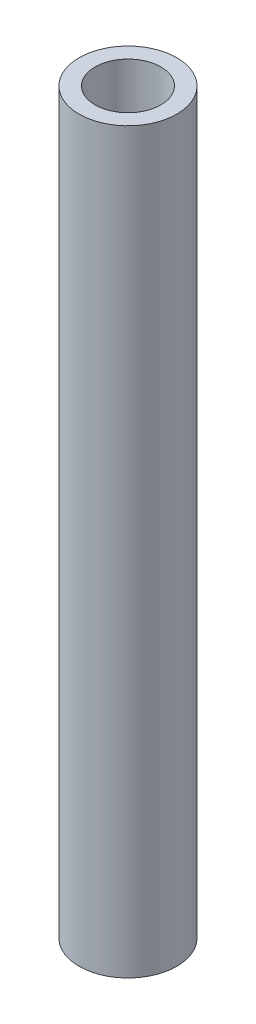
ISO-10303-21;
HEADER;
FILE_DESCRIPTION(('STEP AP214'),'2;1');
FILE_NAME('part.step','',(''),(''),'','','');
FILE_SCHEMA(('AUTOMOTIVE_DESIGN { 1 0 10303 214 1 1 1 1 }'));
ENDSEC;
DATA;
#1=APPLICATION_CONTEXT('core data for automotive mechanical design processes');
#2=APPLICATION_PROTOCOL_DEFINITION('international standard','automotive_design',2000,#1);
#3=PRODUCT_CONTEXT('',#1,'mechanical');
#4=PRODUCT('Part','Part','',(#3));
#5=PRODUCT_RELATED_PRODUCT_CATEGORY('part','',(#4));
#6=PRODUCT_DEFINITION_FORMATION('','',#4);
#7=PRODUCT_DEFINITION_CONTEXT('part definition',#1,'design');
#8=PRODUCT_DEFINITION('design','',#6,#7);
#9=PRODUCT_DEFINITION_SHAPE('','',#8);
#10=(LENGTH_UNIT() NAMED_UNIT(*) SI_UNIT(.MILLI.,.METRE.));
#11=(NAMED_UNIT(*) PLANE_ANGLE_UNIT() SI_UNIT($,.RADIAN.));
#12=(NAMED_UNIT(*) SI_UNIT($,.STERADIAN.) SOLID_ANGLE_UNIT());
#13=UNCERTAINTY_MEASURE_WITH_UNIT(LENGTH_MEASURE(1.E-05),#10,'distance_accuracy_value','');
#14=(GEOMETRIC_REPRESENTATION_CONTEXT(3) GLOBAL_UNCERTAINTY_ASSIGNED_CONTEXT((#13)) GLOBAL_UNIT_ASSIGNED_CONTEXT((#10,
#11,#12)) REPRESENTATION_CONTEXT('',''));
#15=CARTESIAN_POINT('',(0.,0.,0.));
#16=DIRECTION('',(0.,0.,1.));
#17=DIRECTION('',(1.,0.,0.));
#18=AXIS2_PLACEMENT_3D('',#15,#16,#17);
#19=CARTESIAN_POINT('',(0.,18.5,0.));
#20=DIRECTION('',(0.,1.,0.));
#21=DIRECTION('',(0.,0.,1.));
#22=AXIS2_PLACEMENT_3D('',#19,#20,#21);
#23=PLANE('',#22);
#24=CARTESIAN_POINT('',(0.,18.5,0.));
#25=DIRECTION('',(0.,1.,0.));
#26=DIRECTION('',(0.,0.,1.));
#27=AXIS2_PLACEMENT_3D('',#24,#25,#26);
#28=CIRCLE('',#27,2.45);
#29=CARTESIAN_POINT('',(0.,18.5,2.45));
#30=VERTEX_POINT('',#29);
#31=EDGE_CURVE('E10',#30,#30,#28,.T.);
#32=ORIENTED_EDGE('',*,*,#31,.T.);
#33=EDGE_LOOP('',(#32));
#34=FACE_BOUND('',#33,.T.);
#35=CARTESIAN_POINT('',(0.,18.5,0.));
#36=DIRECTION('',(0.,1.,0.));
#37=DIRECTION('',(0.,0.,1.));
#38=AXIS2_PLACEMENT_3D('',#35,#36,#37);
#39=CIRCLE('',#38,1.65);
#40=CARTESIAN_POINT('',(0.,18.5,1.65));
#41=VERTEX_POINT('',#40);
#42=EDGE_CURVE('E50',#41,#41,#39,.T.);
#43=ORIENTED_EDGE('',*,*,#42,.F.);
#44=EDGE_LOOP('',(#43));
#45=FACE_BOUND('',#44,.T.);
#46=ADVANCED_FACE('F37',(#34,#45),#23,.T.);
#47=CARTESIAN_POINT('',(0.,-18.5,0.));
#48=DIRECTION('',(0.,1.,0.));
#49=DIRECTION('',(0.,0.,1.));
#50=AXIS2_PLACEMENT_3D('',#47,#48,#49);
#51=PLANE('',#50);
#52=CARTESIAN_POINT('',(0.,-18.5,0.));
#53=DIRECTION('',(0.,1.,0.));
#54=DIRECTION('',(0.,0.,1.));
#55=AXIS2_PLACEMENT_3D('',#52,#53,#54);
#56=CIRCLE('',#55,2.45);
#57=CARTESIAN_POINT('',(0.,-18.5,2.45));
#58=VERTEX_POINT('',#57);
#59=EDGE_CURVE('E41',#58,#58,#56,.T.);
#60=ORIENTED_EDGE('',*,*,#59,.F.);
#61=EDGE_LOOP('',(#60));
#62=FACE_BOUND('',#61,.T.);
#63=CARTESIAN_POINT('',(0.,-18.5,0.));
#64=DIRECTION('',(0.,1.,0.));
#65=DIRECTION('',(0.,0.,1.));
#66=AXIS2_PLACEMENT_3D('',#63,#64,#65);
#67=CIRCLE('',#66,1.65);
#68=CARTESIAN_POINT('',(0.,-18.5,1.65));
#69=VERTEX_POINT('',#68);
#70=EDGE_CURVE('E52',#69,#69,#67,.T.);
#71=ORIENTED_EDGE('',*,*,#70,.T.);
#72=EDGE_LOOP('',(#71));
#73=FACE_BOUND('',#72,.T.);
#74=ADVANCED_FACE('F64',(#62,#73),#51,.F.);
#75=CARTESIAN_POINT('',(0.,18.5,0.));
#76=DIRECTION('',(0.,-1.,0.));
#77=DIRECTION('',(0.,0.,-1.));
#78=AXIS2_PLACEMENT_3D('',#75,#76,#77);
#79=CYLINDRICAL_SURFACE('',#78,2.45);
#80=ORIENTED_EDGE('',*,*,#31,.F.);
#81=EDGE_LOOP('',(#80));
#82=FACE_BOUND('',#81,.T.);
#83=ORIENTED_EDGE('',*,*,#59,.T.);
#84=EDGE_LOOP('',(#83));
#85=FACE_BOUND('',#84,.T.);
#86=ADVANCED_FACE('F39',(#82,#85),#79,.T.);
#87=CARTESIAN_POINT('',(0.,18.5,0.));
#88=DIRECTION('',(0.,-1.,0.));
#89=DIRECTION('',(0.,0.,-1.));
#90=AXIS2_PLACEMENT_3D('',#87,#88,#89);
#91=CYLINDRICAL_SURFACE('',#90,1.65);
#92=ORIENTED_EDGE('',*,*,#42,.T.);
#93=EDGE_LOOP('',(#92));
#94=FACE_BOUND('',#93,.T.);
#95=ORIENTED_EDGE('',*,*,#70,.F.);
#96=EDGE_LOOP('',(#95));
#97=FACE_BOUND('',#96,.T.);
#98=ADVANCED_FACE('F60',(#94,#97),#91,.F.);
#99=CLOSED_SHELL('',(#46,#74,#86,#98));
#100=MANIFOLD_SOLID_BREP('B2',#99);
#101=ADVANCED_BREP_SHAPE_REPRESENTATION('',(#18,#100),#14);
#102=SHAPE_DEFINITION_REPRESENTATION(#9,#101);
ENDSEC;
END-ISO-10303-21;
